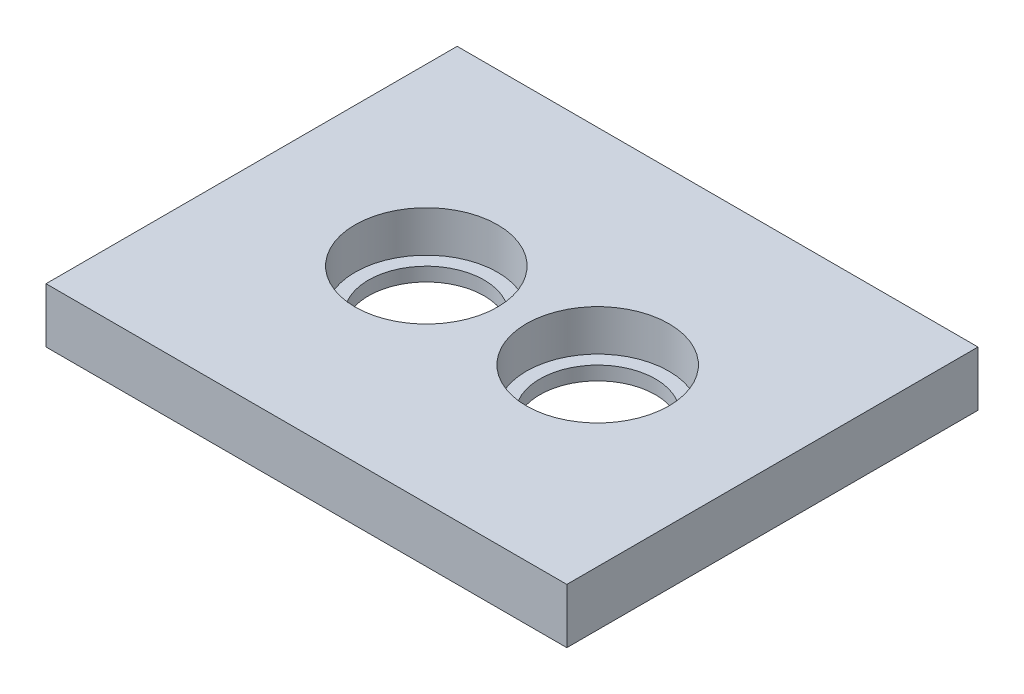
ISO-10303-21;
HEADER;
FILE_DESCRIPTION(('STEP AP214'),'2;1');
FILE_NAME('part.step','',(''),(''),'','','');
FILE_SCHEMA(('AUTOMOTIVE_DESIGN { 1 0 10303 214 1 1 1 1 }'));
ENDSEC;
DATA;
#1=APPLICATION_CONTEXT('core data for automotive mechanical design processes');
#2=APPLICATION_PROTOCOL_DEFINITION('international standard','automotive_design',2000,#1);
#3=PRODUCT_CONTEXT('',#1,'mechanical');
#4=PRODUCT('Part','Part','',(#3));
#5=PRODUCT_RELATED_PRODUCT_CATEGORY('part','',(#4));
#6=PRODUCT_DEFINITION_FORMATION('','',#4);
#7=PRODUCT_DEFINITION_CONTEXT('part definition',#1,'design');
#8=PRODUCT_DEFINITION('design','',#6,#7);
#9=PRODUCT_DEFINITION_SHAPE('','',#8);
#10=(LENGTH_UNIT() NAMED_UNIT(*) SI_UNIT(.MILLI.,.METRE.));
#11=(NAMED_UNIT(*) PLANE_ANGLE_UNIT() SI_UNIT($,.RADIAN.));
#12=(NAMED_UNIT(*) SI_UNIT($,.STERADIAN.) SOLID_ANGLE_UNIT());
#13=UNCERTAINTY_MEASURE_WITH_UNIT(LENGTH_MEASURE(1.E-05),#10,'distance_accuracy_value','');
#14=(GEOMETRIC_REPRESENTATION_CONTEXT(3) GLOBAL_UNCERTAINTY_ASSIGNED_CONTEXT((#13)) GLOBAL_UNIT_ASSIGNED_CONTEXT((#10,
#11,#12)) REPRESENTATION_CONTEXT('',''));
#15=CARTESIAN_POINT('',(0.,0.,0.));
#16=DIRECTION('',(0.,0.,1.));
#17=DIRECTION('',(1.,0.,0.));
#18=AXIS2_PLACEMENT_3D('',#15,#16,#17);
#19=CARTESIAN_POINT('',(-31.25,-0.001000000000001,0.));
#20=DIRECTION('',(0.,1.,0.));
#21=DIRECTION('',(0.,0.,1.));
#22=AXIS2_PLACEMENT_3D('',#19,#20,#21);
#23=CYLINDRICAL_SURFACE('',#22,26.);
#24=CARTESIAN_POINT('',(-31.25,20.,0.));
#25=DIRECTION('',(0.,1.,0.));
#26=DIRECTION('',(0.,0.,1.));
#27=AXIS2_PLACEMENT_3D('',#24,#25,#26);
#28=CIRCLE('',#27,26.);
#29=CARTESIAN_POINT('',(-31.25,20.,26.));
#30=VERTEX_POINT('',#29);
#31=EDGE_CURVE('E247',#30,#30,#28,.T.);
#32=ORIENTED_EDGE('',*,*,#31,.T.);
#33=EDGE_LOOP('',(#32));
#34=FACE_BOUND('',#33,.T.);
#35=CARTESIAN_POINT('',(-31.25,5.,0.));
#36=DIRECTION('',(0.,-1.,0.));
#37=DIRECTION('',(0.,0.,-1.));
#38=AXIS2_PLACEMENT_3D('',#35,#36,#37);
#39=CIRCLE('',#38,26.);
#40=CARTESIAN_POINT('',(-31.25,5.,-26.));
#41=VERTEX_POINT('',#40);
#42=EDGE_CURVE('E11',#41,#41,#39,.F.);
#43=ORIENTED_EDGE('',*,*,#42,.F.);
#44=EDGE_LOOP('',(#43));
#45=FACE_BOUND('',#44,.T.);
#46=ADVANCED_FACE('F34',(#34,#45),#23,.F.);
#47=CARTESIAN_POINT('',(31.25,-0.001000000000001,0.));
#48=DIRECTION('',(0.,1.,0.));
#49=DIRECTION('',(0.,0.,1.));
#50=AXIS2_PLACEMENT_3D('',#47,#48,#49);
#51=CYLINDRICAL_SURFACE('',#50,26.);
#52=CARTESIAN_POINT('',(31.25,20.,0.));
#53=DIRECTION('',(0.,1.,0.));
#54=DIRECTION('',(0.,0.,1.));
#55=AXIS2_PLACEMENT_3D('',#52,#53,#54);
#56=CIRCLE('',#55,26.);
#57=CARTESIAN_POINT('',(31.25,20.,26.));
#58=VERTEX_POINT('',#57);
#59=EDGE_CURVE('E105',#58,#58,#56,.T.);
#60=ORIENTED_EDGE('',*,*,#59,.T.);
#61=EDGE_LOOP('',(#60));
#62=FACE_BOUND('',#61,.T.);
#63=CARTESIAN_POINT('',(31.25,5.,0.));
#64=DIRECTION('',(0.,-1.,0.));
#65=DIRECTION('',(0.,0.,-1.));
#66=AXIS2_PLACEMENT_3D('',#63,#64,#65);
#67=CIRCLE('',#66,26.);
#68=CARTESIAN_POINT('',(31.25,5.,-26.));
#69=VERTEX_POINT('',#68);
#70=EDGE_CURVE('E43',#69,#69,#67,.F.);
#71=ORIENTED_EDGE('',*,*,#70,.F.);
#72=EDGE_LOOP('',(#71));
#73=FACE_BOUND('',#72,.T.);
#74=ADVANCED_FACE('F116',(#62,#73),#51,.F.);
#75=CARTESIAN_POINT('',(95.,20.,75.));
#76=DIRECTION('',(-1.,0.,0.));
#77=DIRECTION('',(0.,0.,1.));
#78=AXIS2_PLACEMENT_3D('',#75,#76,#77);
#79=PLANE('',#78);
#80=DIRECTION('',(0.,0.,-1.));
#81=VECTOR('',#80,1.);
#82=CARTESIAN_POINT('',(95.,0.,75.));
#83=LINE('',#82,#81);
#84=CARTESIAN_POINT('',(95.,0.,75.));
#85=VERTEX_POINT('',#84);
#86=CARTESIAN_POINT('',(95.,0.,-75.));
#87=VERTEX_POINT('',#86);
#88=EDGE_CURVE('E102',#85,#87,#83,.T.);
#89=ORIENTED_EDGE('',*,*,#88,.T.);
#90=DIRECTION('',(0.,-1.,0.));
#91=VECTOR('',#90,1.);
#92=CARTESIAN_POINT('',(95.,20.,-75.));
#93=LINE('',#92,#91);
#94=CARTESIAN_POINT('',(95.,20.,-75.));
#95=VERTEX_POINT('',#94);
#96=EDGE_CURVE('E93',#95,#87,#93,.T.);
#97=ORIENTED_EDGE('',*,*,#96,.F.);
#98=DIRECTION('',(0.,0.,-1.));
#99=VECTOR('',#98,1.);
#100=CARTESIAN_POINT('',(95.,20.,75.));
#101=LINE('',#100,#99);
#102=CARTESIAN_POINT('',(95.,20.,75.));
#103=VERTEX_POINT('',#102);
#104=EDGE_CURVE('E87',#103,#95,#101,.T.);
#105=ORIENTED_EDGE('',*,*,#104,.F.);
#106=DIRECTION('',(0.,-1.,0.));
#107=VECTOR('',#106,1.);
#108=CARTESIAN_POINT('',(95.,20.,75.));
#109=LINE('',#108,#107);
#110=EDGE_CURVE('E98',#103,#85,#109,.T.);
#111=ORIENTED_EDGE('',*,*,#110,.T.);
#112=EDGE_LOOP('',(#89,#97,#105,#111));
#113=FACE_BOUND('',#112,.T.);
#114=ADVANCED_FACE('F36',(#113),#79,.F.);
#115=CARTESIAN_POINT('',(-95.,20.,-75.));
#116=DIRECTION('',(0.,0.,1.));
#117=DIRECTION('',(1.,0.,0.));
#118=AXIS2_PLACEMENT_3D('',#115,#116,#117);
#119=PLANE('',#118);
#120=DIRECTION('',(-1.,0.,0.));
#121=VECTOR('',#120,1.);
#122=CARTESIAN_POINT('',(-95.,0.,-75.));
#123=LINE('',#122,#121);
#124=CARTESIAN_POINT('',(-95.,0.,-75.));
#125=VERTEX_POINT('',#124);
#126=EDGE_CURVE('E92',#87,#125,#123,.T.);
#127=ORIENTED_EDGE('',*,*,#126,.T.);
#128=DIRECTION('',(0.,-1.,0.));
#129=VECTOR('',#128,1.);
#130=CARTESIAN_POINT('',(-95.,20.,-75.));
#131=LINE('',#130,#129);
#132=CARTESIAN_POINT('',(-95.,20.,-75.));
#133=VERTEX_POINT('',#132);
#134=EDGE_CURVE('E90',#133,#125,#131,.T.);
#135=ORIENTED_EDGE('',*,*,#134,.F.);
#136=DIRECTION('',(-1.,0.,0.));
#137=VECTOR('',#136,1.);
#138=CARTESIAN_POINT('',(-95.,20.,-75.));
#139=LINE('',#138,#137);
#140=EDGE_CURVE('E82',#95,#133,#139,.T.);
#141=ORIENTED_EDGE('',*,*,#140,.F.);
#142=ORIENTED_EDGE('',*,*,#96,.T.);
#143=EDGE_LOOP('',(#127,#135,#141,#142));
#144=FACE_BOUND('',#143,.T.);
#145=ADVANCED_FACE('F91',(#144),#119,.F.);
#146=CARTESIAN_POINT('',(-95.,20.,75.));
#147=DIRECTION('',(1.,0.,0.));
#148=DIRECTION('',(0.,0.,-1.));
#149=AXIS2_PLACEMENT_3D('',#146,#147,#148);
#150=PLANE('',#149);
#151=DIRECTION('',(0.,0.,1.));
#152=VECTOR('',#151,1.);
#153=CARTESIAN_POINT('',(-95.,0.,75.));
#154=LINE('',#153,#152);
#155=CARTESIAN_POINT('',(-95.,0.,75.));
#156=VERTEX_POINT('',#155);
#157=EDGE_CURVE('E68',#125,#156,#154,.T.);
#158=ORIENTED_EDGE('',*,*,#157,.T.);
#159=DIRECTION('',(0.,-1.,0.));
#160=VECTOR('',#159,1.);
#161=CARTESIAN_POINT('',(-95.,20.,75.));
#162=LINE('',#161,#160);
#163=CARTESIAN_POINT('',(-95.,20.,75.));
#164=VERTEX_POINT('',#163);
#165=EDGE_CURVE('E94',#164,#156,#162,.T.);
#166=ORIENTED_EDGE('',*,*,#165,.F.);
#167=DIRECTION('',(0.,0.,1.));
#168=VECTOR('',#167,1.);
#169=CARTESIAN_POINT('',(-95.,20.,75.));
#170=LINE('',#169,#168);
#171=EDGE_CURVE('E85',#133,#164,#170,.T.);
#172=ORIENTED_EDGE('',*,*,#171,.F.);
#173=ORIENTED_EDGE('',*,*,#134,.T.);
#174=EDGE_LOOP('',(#158,#166,#172,#173));
#175=FACE_BOUND('',#174,.T.);
#176=ADVANCED_FACE('F96',(#175),#150,.F.);
#177=CARTESIAN_POINT('',(-95.,20.,75.));
#178=DIRECTION('',(0.,0.,-1.));
#179=DIRECTION('',(-1.,0.,0.));
#180=AXIS2_PLACEMENT_3D('',#177,#178,#179);
#181=PLANE('',#180);
#182=DIRECTION('',(1.,0.,0.));
#183=VECTOR('',#182,1.);
#184=CARTESIAN_POINT('',(-95.,0.,75.));
#185=LINE('',#184,#183);
#186=EDGE_CURVE('E74',#156,#85,#185,.T.);
#187=ORIENTED_EDGE('',*,*,#186,.T.);
#188=ORIENTED_EDGE('',*,*,#110,.F.);
#189=DIRECTION('',(1.,0.,0.));
#190=VECTOR('',#189,1.);
#191=CARTESIAN_POINT('',(-95.,20.,75.));
#192=LINE('',#191,#190);
#193=EDGE_CURVE('E51',#164,#103,#192,.T.);
#194=ORIENTED_EDGE('',*,*,#193,.F.);
#195=ORIENTED_EDGE('',*,*,#165,.T.);
#196=EDGE_LOOP('',(#187,#188,#194,#195));
#197=FACE_BOUND('',#196,.T.);
#198=ADVANCED_FACE('F133',(#197),#181,.F.);
#199=CARTESIAN_POINT('',(0.,20.,0.));
#200=DIRECTION('',(0.,-1.,0.));
#201=DIRECTION('',(0.,0.,-1.));
#202=AXIS2_PLACEMENT_3D('',#199,#200,#201);
#203=PLANE('',#202);
#204=ORIENTED_EDGE('',*,*,#31,.F.);
#205=EDGE_LOOP('',(#204));
#206=FACE_BOUND('',#205,.T.);
#207=ORIENTED_EDGE('',*,*,#59,.F.);
#208=EDGE_LOOP('',(#207));
#209=FACE_BOUND('',#208,.T.);
#210=ORIENTED_EDGE('',*,*,#104,.T.);
#211=ORIENTED_EDGE('',*,*,#140,.T.);
#212=ORIENTED_EDGE('',*,*,#171,.T.);
#213=ORIENTED_EDGE('',*,*,#193,.T.);
#214=EDGE_LOOP('',(#210,#211,#212,#213));
#215=FACE_BOUND('',#214,.T.);
#216=ADVANCED_FACE('F83',(#206,#209,#215),#203,.F.);
#217=CARTESIAN_POINT('',(0.,0.,0.));
#218=DIRECTION('',(0.,-1.,0.));
#219=DIRECTION('',(0.,0.,-1.));
#220=AXIS2_PLACEMENT_3D('',#217,#218,#219);
#221=PLANE('',#220);
#222=ORIENTED_EDGE('',*,*,#88,.F.);
#223=ORIENTED_EDGE('',*,*,#186,.F.);
#224=ORIENTED_EDGE('',*,*,#157,.F.);
#225=ORIENTED_EDGE('',*,*,#126,.F.);
#226=EDGE_LOOP('',(#222,#223,#224,#225));
#227=FACE_BOUND('',#226,.T.);
#228=CARTESIAN_POINT('',(31.25,0.,0.));
#229=DIRECTION('',(0.,-1.,0.));
#230=DIRECTION('',(0.,0.,-1.));
#231=AXIS2_PLACEMENT_3D('',#228,#229,#230);
#232=CIRCLE('',#231,21.1);
#233=CARTESIAN_POINT('',(31.25,0.,-21.1));
#234=VERTEX_POINT('',#233);
#235=EDGE_CURVE('E241',#234,#234,#232,.T.);
#236=ORIENTED_EDGE('',*,*,#235,.F.);
#237=EDGE_LOOP('',(#236));
#238=FACE_BOUND('',#237,.T.);
#239=CARTESIAN_POINT('',(-31.25,0.,0.));
#240=DIRECTION('',(0.,-1.,0.));
#241=DIRECTION('',(0.,0.,-1.));
#242=AXIS2_PLACEMENT_3D('',#239,#240,#241);
#243=CIRCLE('',#242,21.1);
#244=CARTESIAN_POINT('',(-31.25,0.,-21.1));
#245=VERTEX_POINT('',#244);
#246=EDGE_CURVE('E238',#245,#245,#243,.T.);
#247=ORIENTED_EDGE('',*,*,#246,.F.);
#248=EDGE_LOOP('',(#247));
#249=FACE_BOUND('',#248,.T.);
#250=ADVANCED_FACE('F132',(#227,#238,#249),#221,.T.);
#251=CARTESIAN_POINT('',(31.25,5.,0.));
#252=DIRECTION('',(0.,-1.,0.));
#253=DIRECTION('',(0.,0.,-1.));
#254=AXIS2_PLACEMENT_3D('',#251,#252,#253);
#255=PLANE('',#254);
#256=CARTESIAN_POINT('',(31.25,5.,0.));
#257=DIRECTION('',(0.,-1.,0.));
#258=DIRECTION('',(0.,0.,-1.));
#259=AXIS2_PLACEMENT_3D('',#256,#257,#258);
#260=CIRCLE('',#259,21.1);
#261=CARTESIAN_POINT('',(31.25,5.,-21.1));
#262=VERTEX_POINT('',#261);
#263=EDGE_CURVE('E244',#262,#262,#260,.T.);
#264=ORIENTED_EDGE('',*,*,#263,.T.);
#265=EDGE_LOOP('',(#264));
#266=FACE_BOUND('',#265,.T.);
#267=ORIENTED_EDGE('',*,*,#70,.T.);
#268=EDGE_LOOP('',(#267));
#269=FACE_BOUND('',#268,.T.);
#270=ADVANCED_FACE('F114',(#266,#269),#255,.F.);
#271=CARTESIAN_POINT('',(31.25,5.,0.));
#272=DIRECTION('',(0.,-1.,0.));
#273=DIRECTION('',(0.,0.,-1.));
#274=AXIS2_PLACEMENT_3D('',#271,#272,#273);
#275=CYLINDRICAL_SURFACE('',#274,21.1);
#276=ORIENTED_EDGE('',*,*,#263,.F.);
#277=EDGE_LOOP('',(#276));
#278=FACE_BOUND('',#277,.T.);
#279=ORIENTED_EDGE('',*,*,#235,.T.);
#280=EDGE_LOOP('',(#279));
#281=FACE_BOUND('',#280,.T.);
#282=ADVANCED_FACE('F169',(#278,#281),#275,.F.);
#283=CARTESIAN_POINT('',(-31.25,5.,0.));
#284=DIRECTION('',(0.,-1.,0.));
#285=DIRECTION('',(0.,0.,-1.));
#286=AXIS2_PLACEMENT_3D('',#283,#284,#285);
#287=PLANE('',#286);
#288=CARTESIAN_POINT('',(-31.25,5.,0.));
#289=DIRECTION('',(0.,-1.,0.));
#290=DIRECTION('',(0.,0.,-1.));
#291=AXIS2_PLACEMENT_3D('',#288,#289,#290);
#292=CIRCLE('',#291,21.1);
#293=CARTESIAN_POINT('',(-31.25,5.,-21.1));
#294=VERTEX_POINT('',#293);
#295=EDGE_CURVE('E235',#294,#294,#292,.T.);
#296=ORIENTED_EDGE('',*,*,#295,.T.);
#297=EDGE_LOOP('',(#296));
#298=FACE_BOUND('',#297,.T.);
#299=ORIENTED_EDGE('',*,*,#42,.T.);
#300=EDGE_LOOP('',(#299));
#301=FACE_BOUND('',#300,.T.);
#302=ADVANCED_FACE('F176',(#298,#301),#287,.F.);
#303=CARTESIAN_POINT('',(-31.25,5.,0.));
#304=DIRECTION('',(0.,-1.,0.));
#305=DIRECTION('',(0.,0.,-1.));
#306=AXIS2_PLACEMENT_3D('',#303,#304,#305);
#307=CYLINDRICAL_SURFACE('',#306,21.1);
#308=ORIENTED_EDGE('',*,*,#295,.F.);
#309=EDGE_LOOP('',(#308));
#310=FACE_BOUND('',#309,.T.);
#311=ORIENTED_EDGE('',*,*,#246,.T.);
#312=EDGE_LOOP('',(#311));
#313=FACE_BOUND('',#312,.T.);
#314=ADVANCED_FACE('F184',(#310,#313),#307,.F.);
#315=CLOSED_SHELL('',(#46,#74,#114,#145,#176,#198,#216,#250,#270,#282,#302,#314));
#316=MANIFOLD_SOLID_BREP('B2',#315);
#317=ADVANCED_BREP_SHAPE_REPRESENTATION('',(#18,#316),#14);
#318=SHAPE_DEFINITION_REPRESENTATION(#9,#317);
ENDSEC;
END-ISO-10303-21;
